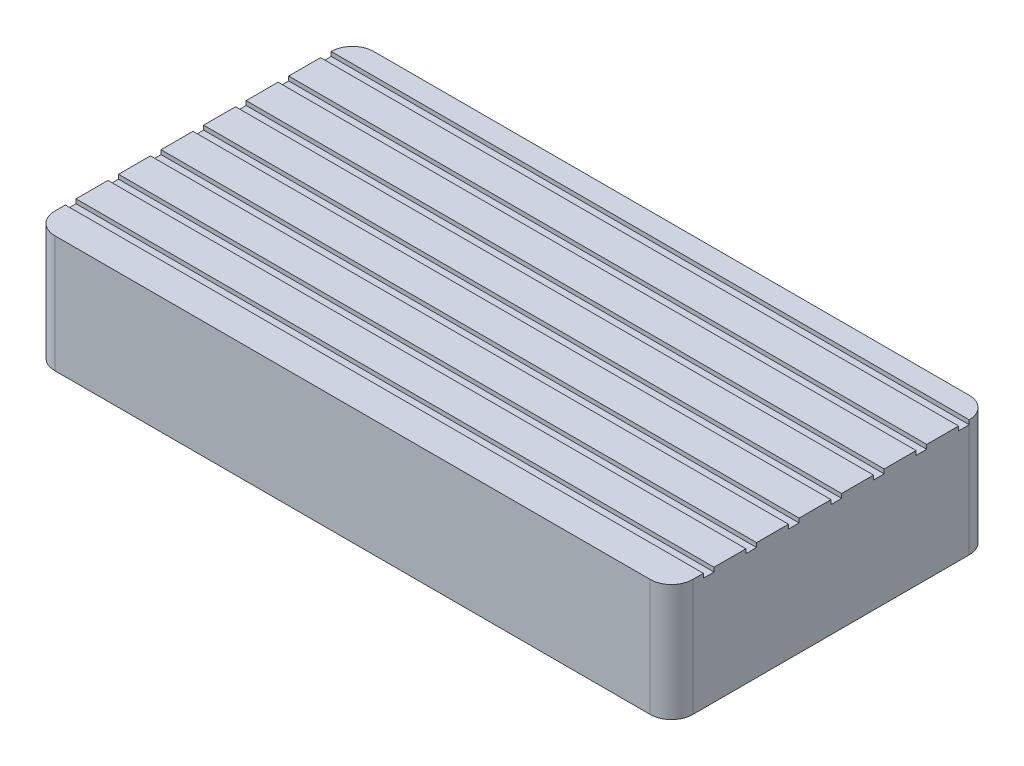
ISO-10303-21;
HEADER;
FILE_DESCRIPTION(('STEP AP214'),'2;1');
FILE_NAME('part.step','',(''),(''),'','','');
FILE_SCHEMA(('AUTOMOTIVE_DESIGN { 1 0 10303 214 1 1 1 1 }'));
ENDSEC;
DATA;
#1=APPLICATION_CONTEXT('core data for automotive mechanical design processes');
#2=APPLICATION_PROTOCOL_DEFINITION('international standard','automotive_design',2000,#1);
#3=PRODUCT_CONTEXT('',#1,'mechanical');
#4=PRODUCT('Part','Part','',(#3));
#5=PRODUCT_RELATED_PRODUCT_CATEGORY('part','',(#4));
#6=PRODUCT_DEFINITION_FORMATION('','',#4);
#7=PRODUCT_DEFINITION_CONTEXT('part definition',#1,'design');
#8=PRODUCT_DEFINITION('design','',#6,#7);
#9=PRODUCT_DEFINITION_SHAPE('','',#8);
#10=(LENGTH_UNIT() NAMED_UNIT(*) SI_UNIT(.MILLI.,.METRE.));
#11=(NAMED_UNIT(*) PLANE_ANGLE_UNIT() SI_UNIT($,.RADIAN.));
#12=(NAMED_UNIT(*) SI_UNIT($,.STERADIAN.) SOLID_ANGLE_UNIT());
#13=UNCERTAINTY_MEASURE_WITH_UNIT(LENGTH_MEASURE(1.E-05),#10,'distance_accuracy_value','');
#14=(GEOMETRIC_REPRESENTATION_CONTEXT(3) GLOBAL_UNCERTAINTY_ASSIGNED_CONTEXT((#13)) GLOBAL_UNIT_ASSIGNED_CONTEXT((#10,
#11,#12)) REPRESENTATION_CONTEXT('',''));
#15=CARTESIAN_POINT('',(0.,0.,0.));
#16=DIRECTION('',(0.,0.,1.));
#17=DIRECTION('',(1.,0.,0.));
#18=AXIS2_PLACEMENT_3D('',#15,#16,#17);
#19=CARTESIAN_POINT('',(0.,5.5,0.));
#20=DIRECTION('',(0.,-1.,0.));
#21=DIRECTION('',(0.,0.,-1.));
#22=AXIS2_PLACEMENT_3D('',#19,#20,#21);
#23=PLANE('',#22);
#24=DIRECTION('',(0.,0.,1.));
#25=VECTOR('',#24,1.);
#26=CARTESIAN_POINT('',(-15.,5.5,7.5));
#27=LINE('',#26,#25);
#28=CARTESIAN_POINT('',(-15.,5.5,6.));
#29=VERTEX_POINT('',#28);
#30=CARTESIAN_POINT('',(-15.,5.5,6.5));
#31=VERTEX_POINT('',#30);
#32=EDGE_CURVE('E457',#29,#31,#27,.T.);
#33=ORIENTED_EDGE('',*,*,#32,.T.);
#34=CARTESIAN_POINT('',(-14.,5.5,6.5));
#35=DIRECTION('',(0.,-1.,0.));
#36=DIRECTION('',(0.,0.,-1.));
#37=AXIS2_PLACEMENT_3D('',#34,#35,#36);
#38=CIRCLE('',#37,1.);
#39=CARTESIAN_POINT('',(-14.,5.5,7.5));
#40=VERTEX_POINT('',#39);
#41=EDGE_CURVE('E499',#31,#40,#38,.F.);
#42=ORIENTED_EDGE('',*,*,#41,.T.);
#43=DIRECTION('',(1.,0.,0.));
#44=VECTOR('',#43,1.);
#45=CARTESIAN_POINT('',(-15.,5.5,7.5));
#46=LINE('',#45,#44);
#47=CARTESIAN_POINT('',(14.,5.5,7.5));
#48=VERTEX_POINT('',#47);
#49=EDGE_CURVE('E463',#40,#48,#46,.T.);
#50=ORIENTED_EDGE('',*,*,#49,.T.);
#51=CARTESIAN_POINT('',(14.,5.5,6.5));
#52=DIRECTION('',(0.,-1.,0.));
#53=DIRECTION('',(0.,0.,-1.));
#54=AXIS2_PLACEMENT_3D('',#51,#52,#53);
#55=CIRCLE('',#54,1.);
#56=CARTESIAN_POINT('',(15.,5.5,6.5));
#57=VERTEX_POINT('',#56);
#58=EDGE_CURVE('E497',#48,#57,#55,.F.);
#59=ORIENTED_EDGE('',*,*,#58,.T.);
#60=DIRECTION('',(0.,0.,-1.));
#61=VECTOR('',#60,1.);
#62=CARTESIAN_POINT('',(15.,5.5,7.5));
#63=LINE('',#62,#61);
#64=CARTESIAN_POINT('',(15.,5.5,6.));
#65=VERTEX_POINT('',#64);
#66=EDGE_CURVE('E467',#57,#65,#63,.T.);
#67=ORIENTED_EDGE('',*,*,#66,.T.);
#68=DIRECTION('',(1.,0.,0.));
#69=VECTOR('',#68,1.);
#70=CARTESIAN_POINT('',(-15.,5.5,6.));
#71=LINE('',#70,#69);
#72=EDGE_CURVE('E279',#29,#65,#71,.T.);
#73=ORIENTED_EDGE('',*,*,#72,.F.);
#74=EDGE_LOOP('',(#33,#42,#50,#59,#67,#73));
#75=FACE_BOUND('',#74,.T.);
#76=ADVANCED_FACE('F33',(#75),#23,.F.);
#77=CARTESIAN_POINT('',(-15.,5.5,4.));
#78=VERTEX_POINT('',#77);
#79=CARTESIAN_POINT('',(-15.,5.5,5.5));
#80=VERTEX_POINT('',#79);
#81=EDGE_CURVE('E460',#78,#80,#27,.T.);
#82=ORIENTED_EDGE('',*,*,#81,.T.);
#83=DIRECTION('',(1.,0.,0.));
#84=VECTOR('',#83,1.);
#85=CARTESIAN_POINT('',(-15.,5.5,5.5));
#86=LINE('',#85,#84);
#87=CARTESIAN_POINT('',(15.,5.5,5.5));
#88=VERTEX_POINT('',#87);
#89=EDGE_CURVE('E298',#80,#88,#86,.T.);
#90=ORIENTED_EDGE('',*,*,#89,.T.);
#91=CARTESIAN_POINT('',(15.,5.5,4.));
#92=VERTEX_POINT('',#91);
#93=EDGE_CURVE('E470',#88,#92,#63,.T.);
#94=ORIENTED_EDGE('',*,*,#93,.T.);
#95=DIRECTION('',(1.,0.,0.));
#96=VECTOR('',#95,1.);
#97=CARTESIAN_POINT('',(-15.,5.5,4.));
#98=LINE('',#97,#96);
#99=EDGE_CURVE('E282',#78,#92,#98,.T.);
#100=ORIENTED_EDGE('',*,*,#99,.F.);
#101=EDGE_LOOP('',(#82,#90,#94,#100));
#102=FACE_BOUND('',#101,.T.);
#103=ADVANCED_FACE('F573',(#102),#23,.F.);
#104=CARTESIAN_POINT('',(-15.,5.5,2.));
#105=VERTEX_POINT('',#104);
#106=CARTESIAN_POINT('',(-15.,5.5,3.5));
#107=VERTEX_POINT('',#106);
#108=EDGE_CURVE('E582',#105,#107,#27,.T.);
#109=ORIENTED_EDGE('',*,*,#108,.T.);
#110=DIRECTION('',(1.,0.,0.));
#111=VECTOR('',#110,1.);
#112=CARTESIAN_POINT('',(-15.,5.5,3.5));
#113=LINE('',#112,#111);
#114=CARTESIAN_POINT('',(15.,5.5,3.5));
#115=VERTEX_POINT('',#114);
#116=EDGE_CURVE('E322',#107,#115,#113,.T.);
#117=ORIENTED_EDGE('',*,*,#116,.T.);
#118=CARTESIAN_POINT('',(15.,5.5,2.));
#119=VERTEX_POINT('',#118);
#120=EDGE_CURVE('E561',#115,#119,#63,.T.);
#121=ORIENTED_EDGE('',*,*,#120,.T.);
#122=DIRECTION('',(1.,0.,0.));
#123=VECTOR('',#122,1.);
#124=CARTESIAN_POINT('',(-15.,5.5,2.));
#125=LINE('',#124,#123);
#126=EDGE_CURVE('E306',#105,#119,#125,.T.);
#127=ORIENTED_EDGE('',*,*,#126,.F.);
#128=EDGE_LOOP('',(#109,#117,#121,#127));
#129=FACE_BOUND('',#128,.T.);
#130=ADVANCED_FACE('F640',(#129),#23,.F.);
#131=CARTESIAN_POINT('',(-15.,5.5,0.));
#132=VERTEX_POINT('',#131);
#133=CARTESIAN_POINT('',(-15.,5.5,1.5));
#134=VERTEX_POINT('',#133);
#135=EDGE_CURVE('E584',#132,#134,#27,.T.);
#136=ORIENTED_EDGE('',*,*,#135,.T.);
#137=DIRECTION('',(1.,0.,0.));
#138=VECTOR('',#137,1.);
#139=CARTESIAN_POINT('',(-15.,5.5,1.5));
#140=LINE('',#139,#138);
#141=CARTESIAN_POINT('',(15.,5.5,1.5));
#142=VERTEX_POINT('',#141);
#143=EDGE_CURVE('E348',#134,#142,#140,.T.);
#144=ORIENTED_EDGE('',*,*,#143,.T.);
#145=CARTESIAN_POINT('',(15.,5.5,0.));
#146=VERTEX_POINT('',#145);
#147=EDGE_CURVE('E556',#142,#146,#63,.T.);
#148=ORIENTED_EDGE('',*,*,#147,.T.);
#149=DIRECTION('',(1.,0.,0.));
#150=VECTOR('',#149,1.);
#151=CARTESIAN_POINT('',(-15.,5.5,0.));
#152=LINE('',#151,#150);
#153=EDGE_CURVE('E332',#132,#146,#152,.T.);
#154=ORIENTED_EDGE('',*,*,#153,.F.);
#155=EDGE_LOOP('',(#136,#144,#148,#154));
#156=FACE_BOUND('',#155,.T.);
#157=ADVANCED_FACE('F628',(#156),#23,.F.);
#158=CARTESIAN_POINT('',(-15.,5.5,-2.));
#159=VERTEX_POINT('',#158);
#160=CARTESIAN_POINT('',(-15.,5.5,-0.500000000000002));
#161=VERTEX_POINT('',#160);
#162=EDGE_CURVE('E587',#159,#161,#27,.T.);
#163=ORIENTED_EDGE('',*,*,#162,.T.);
#164=DIRECTION('',(1.,0.,0.));
#165=VECTOR('',#164,1.);
#166=CARTESIAN_POINT('',(-15.,5.5,-0.500000000000002));
#167=LINE('',#166,#165);
#168=CARTESIAN_POINT('',(15.,5.5,-0.500000000000002));
#169=VERTEX_POINT('',#168);
#170=EDGE_CURVE('E374',#161,#169,#167,.T.);
#171=ORIENTED_EDGE('',*,*,#170,.T.);
#172=CARTESIAN_POINT('',(15.,5.5,-2.));
#173=VERTEX_POINT('',#172);
#174=EDGE_CURVE('E551',#169,#173,#63,.T.);
#175=ORIENTED_EDGE('',*,*,#174,.T.);
#176=DIRECTION('',(1.,0.,0.));
#177=VECTOR('',#176,1.);
#178=CARTESIAN_POINT('',(-15.,5.5,-2.));
#179=LINE('',#178,#177);
#180=EDGE_CURVE('E358',#159,#173,#179,.T.);
#181=ORIENTED_EDGE('',*,*,#180,.F.);
#182=EDGE_LOOP('',(#163,#171,#175,#181));
#183=FACE_BOUND('',#182,.T.);
#184=ADVANCED_FACE('F616',(#183),#23,.F.);
#185=CARTESIAN_POINT('',(-15.,5.5,-4.));
#186=VERTEX_POINT('',#185);
#187=CARTESIAN_POINT('',(-15.,5.5,-2.5));
#188=VERTEX_POINT('',#187);
#189=EDGE_CURVE('E590',#186,#188,#27,.T.);
#190=ORIENTED_EDGE('',*,*,#189,.T.);
#191=DIRECTION('',(1.,0.,0.));
#192=VECTOR('',#191,1.);
#193=CARTESIAN_POINT('',(-15.,5.5,-2.5));
#194=LINE('',#193,#192);
#195=CARTESIAN_POINT('',(15.,5.5,-2.5));
#196=VERTEX_POINT('',#195);
#197=EDGE_CURVE('E400',#188,#196,#194,.T.);
#198=ORIENTED_EDGE('',*,*,#197,.T.);
#199=CARTESIAN_POINT('',(15.,5.5,-4.));
#200=VERTEX_POINT('',#199);
#201=EDGE_CURVE('E549',#196,#200,#63,.T.);
#202=ORIENTED_EDGE('',*,*,#201,.T.);
#203=DIRECTION('',(1.,0.,0.));
#204=VECTOR('',#203,1.);
#205=CARTESIAN_POINT('',(-15.,5.5,-4.));
#206=LINE('',#205,#204);
#207=EDGE_CURVE('E384',#186,#200,#206,.T.);
#208=ORIENTED_EDGE('',*,*,#207,.F.);
#209=EDGE_LOOP('',(#190,#198,#202,#208));
#210=FACE_BOUND('',#209,.T.);
#211=ADVANCED_FACE('F604',(#210),#23,.F.);
#212=CARTESIAN_POINT('',(-15.,5.5,-6.));
#213=VERTEX_POINT('',#212);
#214=CARTESIAN_POINT('',(-15.,5.5,-4.5));
#215=VERTEX_POINT('',#214);
#216=EDGE_CURVE('E462',#213,#215,#27,.T.);
#217=ORIENTED_EDGE('',*,*,#216,.T.);
#218=DIRECTION('',(1.,0.,0.));
#219=VECTOR('',#218,1.);
#220=CARTESIAN_POINT('',(-15.,5.5,-4.5));
#221=LINE('',#220,#219);
#222=CARTESIAN_POINT('',(15.,5.5,-4.5));
#223=VERTEX_POINT('',#222);
#224=EDGE_CURVE('E426',#215,#223,#221,.T.);
#225=ORIENTED_EDGE('',*,*,#224,.T.);
#226=CARTESIAN_POINT('',(15.,5.5,-6.));
#227=VERTEX_POINT('',#226);
#228=EDGE_CURVE('E466',#223,#227,#63,.T.);
#229=ORIENTED_EDGE('',*,*,#228,.T.);
#230=DIRECTION('',(1.,0.,0.));
#231=VECTOR('',#230,1.);
#232=CARTESIAN_POINT('',(-15.,5.5,-6.));
#233=LINE('',#232,#231);
#234=EDGE_CURVE('E410',#213,#227,#233,.T.);
#235=ORIENTED_EDGE('',*,*,#234,.F.);
#236=EDGE_LOOP('',(#217,#225,#229,#235));
#237=FACE_BOUND('',#236,.T.);
#238=ADVANCED_FACE('F548',(#237),#23,.F.);
#239=CARTESIAN_POINT('',(-15.,5.5,7.5));
#240=DIRECTION('',(1.,0.,0.));
#241=DIRECTION('',(0.,0.,-1.));
#242=AXIS2_PLACEMENT_3D('',#239,#240,#241);
#243=PLANE('',#242);
#244=DIRECTION('',(0.,0.,1.));
#245=VECTOR('',#244,1.);
#246=CARTESIAN_POINT('',(-15.,0.,7.5));
#247=LINE('',#246,#245);
#248=CARTESIAN_POINT('',(-15.,0.,-6.5));
#249=VERTEX_POINT('',#248);
#250=CARTESIAN_POINT('',(-15.,0.,6.5));
#251=VERTEX_POINT('',#250);
#252=EDGE_CURVE('E297',#249,#251,#247,.T.);
#253=ORIENTED_EDGE('',*,*,#252,.T.);
#254=DIRECTION('',(0.,-1.,0.));
#255=VECTOR('',#254,1.);
#256=CARTESIAN_POINT('',(-15.,5.5,6.5));
#257=LINE('',#256,#255);
#258=EDGE_CURVE('E495',#251,#31,#257,.F.);
#259=ORIENTED_EDGE('',*,*,#258,.T.);
#260=ORIENTED_EDGE('',*,*,#32,.F.);
#261=DIRECTION('',(0.,-1.,0.));
#262=VECTOR('',#261,1.);
#263=CARTESIAN_POINT('',(-15.,5.5,6.));
#264=LINE('',#263,#262);
#265=CARTESIAN_POINT('',(-15.,5.3,6.));
#266=VERTEX_POINT('',#265);
#267=EDGE_CURVE('E289',#29,#266,#264,.T.);
#268=ORIENTED_EDGE('',*,*,#267,.T.);
#269=DIRECTION('',(0.,0.,-1.));
#270=VECTOR('',#269,1.);
#271=CARTESIAN_POINT('',(-15.,5.3,6.));
#272=LINE('',#271,#270);
#273=CARTESIAN_POINT('',(-15.,5.3,5.5));
#274=VERTEX_POINT('',#273);
#275=EDGE_CURVE('E268',#266,#274,#272,.T.);
#276=ORIENTED_EDGE('',*,*,#275,.T.);
#277=DIRECTION('',(0.,1.,0.));
#278=VECTOR('',#277,1.);
#279=CARTESIAN_POINT('',(-15.,5.5,5.5));
#280=LINE('',#279,#278);
#281=EDGE_CURVE('E272',#274,#80,#280,.T.);
#282=ORIENTED_EDGE('',*,*,#281,.T.);
#283=ORIENTED_EDGE('',*,*,#81,.F.);
#284=DIRECTION('',(0.,-1.,0.));
#285=VECTOR('',#284,1.);
#286=CARTESIAN_POINT('',(-15.,5.5,4.));
#287=LINE('',#286,#285);
#288=CARTESIAN_POINT('',(-15.,5.3,4.));
#289=VERTEX_POINT('',#288);
#290=EDGE_CURVE('E311',#78,#289,#287,.T.);
#291=ORIENTED_EDGE('',*,*,#290,.T.);
#292=DIRECTION('',(0.,0.,-1.));
#293=VECTOR('',#292,1.);
#294=CARTESIAN_POINT('',(-15.,5.3,4.));
#295=LINE('',#294,#293);
#296=CARTESIAN_POINT('',(-15.,5.3,3.5));
#297=VERTEX_POINT('',#296);
#298=EDGE_CURVE('E314',#289,#297,#295,.T.);
#299=ORIENTED_EDGE('',*,*,#298,.T.);
#300=DIRECTION('',(0.,1.,0.));
#301=VECTOR('',#300,1.);
#302=CARTESIAN_POINT('',(-15.,5.5,3.5));
#303=LINE('',#302,#301);
#304=EDGE_CURVE('E317',#297,#107,#303,.T.);
#305=ORIENTED_EDGE('',*,*,#304,.T.);
#306=ORIENTED_EDGE('',*,*,#108,.F.);
#307=DIRECTION('',(0.,-1.,0.));
#308=VECTOR('',#307,1.);
#309=CARTESIAN_POINT('',(-15.,5.5,2.));
#310=LINE('',#309,#308);
#311=CARTESIAN_POINT('',(-15.,5.3,2.));
#312=VERTEX_POINT('',#311);
#313=EDGE_CURVE('E337',#105,#312,#310,.T.);
#314=ORIENTED_EDGE('',*,*,#313,.T.);
#315=DIRECTION('',(0.,0.,-1.));
#316=VECTOR('',#315,1.);
#317=CARTESIAN_POINT('',(-15.,5.3,2.));
#318=LINE('',#317,#316);
#319=CARTESIAN_POINT('',(-15.,5.3,1.5));
#320=VERTEX_POINT('',#319);
#321=EDGE_CURVE('E340',#312,#320,#318,.T.);
#322=ORIENTED_EDGE('',*,*,#321,.T.);
#323=DIRECTION('',(0.,1.,0.));
#324=VECTOR('',#323,1.);
#325=CARTESIAN_POINT('',(-15.,5.5,1.5));
#326=LINE('',#325,#324);
#327=EDGE_CURVE('E343',#320,#134,#326,.T.);
#328=ORIENTED_EDGE('',*,*,#327,.T.);
#329=ORIENTED_EDGE('',*,*,#135,.F.);
#330=DIRECTION('',(0.,-1.,0.));
#331=VECTOR('',#330,1.);
#332=CARTESIAN_POINT('',(-15.,5.5,0.));
#333=LINE('',#332,#331);
#334=CARTESIAN_POINT('',(-15.,5.3,0.));
#335=VERTEX_POINT('',#334);
#336=EDGE_CURVE('E363',#132,#335,#333,.T.);
#337=ORIENTED_EDGE('',*,*,#336,.T.);
#338=DIRECTION('',(0.,0.,-1.));
#339=VECTOR('',#338,1.);
#340=CARTESIAN_POINT('',(-15.,5.3,0.));
#341=LINE('',#340,#339);
#342=CARTESIAN_POINT('',(-15.,5.3,-0.500000000000002));
#343=VERTEX_POINT('',#342);
#344=EDGE_CURVE('E366',#335,#343,#341,.T.);
#345=ORIENTED_EDGE('',*,*,#344,.T.);
#346=DIRECTION('',(0.,1.,0.));
#347=VECTOR('',#346,1.);
#348=CARTESIAN_POINT('',(-15.,5.5,-0.500000000000002));
#349=LINE('',#348,#347);
#350=EDGE_CURVE('E369',#343,#161,#349,.T.);
#351=ORIENTED_EDGE('',*,*,#350,.T.);
#352=ORIENTED_EDGE('',*,*,#162,.F.);
#353=DIRECTION('',(0.,-1.,0.));
#354=VECTOR('',#353,1.);
#355=CARTESIAN_POINT('',(-15.,5.5,-2.));
#356=LINE('',#355,#354);
#357=CARTESIAN_POINT('',(-15.,5.3,-2.));
#358=VERTEX_POINT('',#357);
#359=EDGE_CURVE('E389',#159,#358,#356,.T.);
#360=ORIENTED_EDGE('',*,*,#359,.T.);
#361=DIRECTION('',(0.,0.,-1.));
#362=VECTOR('',#361,1.);
#363=CARTESIAN_POINT('',(-15.,5.3,-2.));
#364=LINE('',#363,#362);
#365=CARTESIAN_POINT('',(-15.,5.3,-2.5));
#366=VERTEX_POINT('',#365);
#367=EDGE_CURVE('E392',#358,#366,#364,.T.);
#368=ORIENTED_EDGE('',*,*,#367,.T.);
#369=DIRECTION('',(0.,1.,0.));
#370=VECTOR('',#369,1.);
#371=CARTESIAN_POINT('',(-15.,5.5,-2.5));
#372=LINE('',#371,#370);
#373=EDGE_CURVE('E395',#366,#188,#372,.T.);
#374=ORIENTED_EDGE('',*,*,#373,.T.);
#375=ORIENTED_EDGE('',*,*,#189,.F.);
#376=DIRECTION('',(0.,-1.,0.));
#377=VECTOR('',#376,1.);
#378=CARTESIAN_POINT('',(-15.,5.5,-4.));
#379=LINE('',#378,#377);
#380=CARTESIAN_POINT('',(-15.,5.3,-4.));
#381=VERTEX_POINT('',#380);
#382=EDGE_CURVE('E415',#186,#381,#379,.T.);
#383=ORIENTED_EDGE('',*,*,#382,.T.);
#384=DIRECTION('',(0.,0.,-1.));
#385=VECTOR('',#384,1.);
#386=CARTESIAN_POINT('',(-15.,5.3,-4.));
#387=LINE('',#386,#385);
#388=CARTESIAN_POINT('',(-15.,5.3,-4.5));
#389=VERTEX_POINT('',#388);
#390=EDGE_CURVE('E418',#381,#389,#387,.T.);
#391=ORIENTED_EDGE('',*,*,#390,.T.);
#392=DIRECTION('',(0.,1.,0.));
#393=VECTOR('',#392,1.);
#394=CARTESIAN_POINT('',(-15.,5.5,-4.5));
#395=LINE('',#394,#393);
#396=EDGE_CURVE('E421',#389,#215,#395,.T.);
#397=ORIENTED_EDGE('',*,*,#396,.T.);
#398=ORIENTED_EDGE('',*,*,#216,.F.);
#399=DIRECTION('',(0.,-1.,0.));
#400=VECTOR('',#399,1.);
#401=CARTESIAN_POINT('',(-15.,5.5,-6.));
#402=LINE('',#401,#400);
#403=CARTESIAN_POINT('',(-15.,5.3,-6.));
#404=VERTEX_POINT('',#403);
#405=EDGE_CURVE('E440',#213,#404,#402,.T.);
#406=ORIENTED_EDGE('',*,*,#405,.T.);
#407=DIRECTION('',(0.,0.,-1.));
#408=VECTOR('',#407,1.);
#409=CARTESIAN_POINT('',(-15.,5.3,-6.));
#410=LINE('',#409,#408);
#411=CARTESIAN_POINT('',(-15.,5.3,-6.5));
#412=VERTEX_POINT('',#411);
#413=EDGE_CURVE('E443',#404,#412,#410,.T.);
#414=ORIENTED_EDGE('',*,*,#413,.T.);
#415=DIRECTION('',(0.,-1.,0.));
#416=VECTOR('',#415,1.);
#417=CARTESIAN_POINT('',(-15.,5.5,-6.5));
#418=LINE('',#417,#416);
#419=EDGE_CURVE('E493',#412,#249,#418,.T.);
#420=ORIENTED_EDGE('',*,*,#419,.T.);
#421=EDGE_LOOP('',(#253,#259,#260,#268,#276,#282,#283,#291,#299,#305,#306,#314,#322,#328,#329,
#337,#345,#351,#352,#360,#368,#374,#375,#383,#391,#397,#398,#406,#414,#420));
#422=FACE_BOUND('',#421,.T.);
#423=ADVANCED_FACE('F534',(#422),#243,.F.);
#424=CARTESIAN_POINT('',(-15.,5.5,7.5));
#425=DIRECTION('',(0.,0.,-1.));
#426=DIRECTION('',(-1.,0.,0.));
#427=AXIS2_PLACEMENT_3D('',#424,#425,#426);
#428=PLANE('',#427);
#429=ORIENTED_EDGE('',*,*,#49,.F.);
#430=DIRECTION('',(0.,-1.,0.));
#431=VECTOR('',#430,1.);
#432=CARTESIAN_POINT('',(-14.,5.5,7.5));
#433=LINE('',#432,#431);
#434=CARTESIAN_POINT('',(-14.,0.,7.5));
#435=VERTEX_POINT('',#434);
#436=EDGE_CURVE('E482',#40,#435,#433,.T.);
#437=ORIENTED_EDGE('',*,*,#436,.T.);
#438=DIRECTION('',(1.,0.,0.));
#439=VECTOR('',#438,1.);
#440=CARTESIAN_POINT('',(-15.,0.,7.5));
#441=LINE('',#440,#439);
#442=CARTESIAN_POINT('',(14.,0.,7.5));
#443=VERTEX_POINT('',#442);
#444=EDGE_CURVE('E475',#435,#443,#441,.T.);
#445=ORIENTED_EDGE('',*,*,#444,.T.);
#446=DIRECTION('',(0.,-1.,0.));
#447=VECTOR('',#446,1.);
#448=CARTESIAN_POINT('',(14.,5.5,7.5));
#449=LINE('',#448,#447);
#450=EDGE_CURVE('E472',#443,#48,#449,.F.);
#451=ORIENTED_EDGE('',*,*,#450,.T.);
#452=EDGE_LOOP('',(#429,#437,#445,#451));
#453=FACE_BOUND('',#452,.T.);
#454=ADVANCED_FACE('F676',(#453),#428,.F.);
#455=CARTESIAN_POINT('',(15.,5.5,7.5));
#456=DIRECTION('',(-1.,0.,0.));
#457=DIRECTION('',(0.,0.,1.));
#458=AXIS2_PLACEMENT_3D('',#455,#456,#457);
#459=PLANE('',#458);
#460=DIRECTION('',(0.,0.,-1.));
#461=VECTOR('',#460,1.);
#462=CARTESIAN_POINT('',(15.,0.,7.5));
#463=LINE('',#462,#461);
#464=CARTESIAN_POINT('',(15.,0.,6.5));
#465=VERTEX_POINT('',#464);
#466=CARTESIAN_POINT('',(15.,0.,-6.5));
#467=VERTEX_POINT('',#466);
#468=EDGE_CURVE('E478',#465,#467,#463,.T.);
#469=ORIENTED_EDGE('',*,*,#468,.T.);
#470=DIRECTION('',(0.,-1.,0.));
#471=VECTOR('',#470,1.);
#472=CARTESIAN_POINT('',(15.,5.5,-6.5));
#473=LINE('',#472,#471);
#474=CARTESIAN_POINT('',(15.,5.3,-6.5));
#475=VERTEX_POINT('',#474);
#476=EDGE_CURVE('E11',#467,#475,#473,.F.);
#477=ORIENTED_EDGE('',*,*,#476,.T.);
#478=DIRECTION('',(0.,0.,-1.));
#479=VECTOR('',#478,1.);
#480=CARTESIAN_POINT('',(15.,5.3,-6.));
#481=LINE('',#480,#479);
#482=CARTESIAN_POINT('',(15.,5.3,-6.));
#483=VERTEX_POINT('',#482);
#484=EDGE_CURVE('E435',#483,#475,#481,.T.);
#485=ORIENTED_EDGE('',*,*,#484,.F.);
#486=DIRECTION('',(0.,-1.,0.));
#487=VECTOR('',#486,1.);
#488=CARTESIAN_POINT('',(15.,5.5,-6.));
#489=LINE('',#488,#487);
#490=EDGE_CURVE('E432',#227,#483,#489,.T.);
#491=ORIENTED_EDGE('',*,*,#490,.F.);
#492=ORIENTED_EDGE('',*,*,#228,.F.);
#493=DIRECTION('',(0.,1.,0.));
#494=VECTOR('',#493,1.);
#495=CARTESIAN_POINT('',(15.,5.5,-4.5));
#496=LINE('',#495,#494);
#497=CARTESIAN_POINT('',(15.,5.3,-4.5));
#498=VERTEX_POINT('',#497);
#499=EDGE_CURVE('E413',#498,#223,#496,.T.);
#500=ORIENTED_EDGE('',*,*,#499,.F.);
#501=DIRECTION('',(0.,0.,-1.));
#502=VECTOR('',#501,1.);
#503=CARTESIAN_POINT('',(15.,5.3,-4.));
#504=LINE('',#503,#502);
#505=CARTESIAN_POINT('',(15.,5.3,-4.));
#506=VERTEX_POINT('',#505);
#507=EDGE_CURVE('E409',#506,#498,#504,.T.);
#508=ORIENTED_EDGE('',*,*,#507,.F.);
#509=DIRECTION('',(0.,-1.,0.));
#510=VECTOR('',#509,1.);
#511=CARTESIAN_POINT('',(15.,5.5,-4.));
#512=LINE('',#511,#510);
#513=EDGE_CURVE('E406',#200,#506,#512,.T.);
#514=ORIENTED_EDGE('',*,*,#513,.F.);
#515=ORIENTED_EDGE('',*,*,#201,.F.);
#516=DIRECTION('',(0.,1.,0.));
#517=VECTOR('',#516,1.);
#518=CARTESIAN_POINT('',(15.,5.5,-2.5));
#519=LINE('',#518,#517);
#520=CARTESIAN_POINT('',(15.,5.3,-2.5));
#521=VERTEX_POINT('',#520);
#522=EDGE_CURVE('E387',#521,#196,#519,.T.);
#523=ORIENTED_EDGE('',*,*,#522,.F.);
#524=DIRECTION('',(0.,0.,-1.));
#525=VECTOR('',#524,1.);
#526=CARTESIAN_POINT('',(15.,5.3,-2.));
#527=LINE('',#526,#525);
#528=CARTESIAN_POINT('',(15.,5.3,-2.));
#529=VERTEX_POINT('',#528);
#530=EDGE_CURVE('E383',#529,#521,#527,.T.);
#531=ORIENTED_EDGE('',*,*,#530,.F.);
#532=DIRECTION('',(0.,-1.,0.));
#533=VECTOR('',#532,1.);
#534=CARTESIAN_POINT('',(15.,5.5,-2.));
#535=LINE('',#534,#533);
#536=EDGE_CURVE('E380',#173,#529,#535,.T.);
#537=ORIENTED_EDGE('',*,*,#536,.F.);
#538=ORIENTED_EDGE('',*,*,#174,.F.);
#539=DIRECTION('',(0.,1.,0.));
#540=VECTOR('',#539,1.);
#541=CARTESIAN_POINT('',(15.,5.5,-0.500000000000002));
#542=LINE('',#541,#540);
#543=CARTESIAN_POINT('',(15.,5.3,-0.500000000000002));
#544=VERTEX_POINT('',#543);
#545=EDGE_CURVE('E361',#544,#169,#542,.T.);
#546=ORIENTED_EDGE('',*,*,#545,.F.);
#547=DIRECTION('',(0.,0.,-1.));
#548=VECTOR('',#547,1.);
#549=CARTESIAN_POINT('',(15.,5.3,0.));
#550=LINE('',#549,#548);
#551=CARTESIAN_POINT('',(15.,5.3,0.));
#552=VERTEX_POINT('',#551);
#553=EDGE_CURVE('E357',#552,#544,#550,.T.);
#554=ORIENTED_EDGE('',*,*,#553,.F.);
#555=DIRECTION('',(0.,-1.,0.));
#556=VECTOR('',#555,1.);
#557=CARTESIAN_POINT('',(15.,5.5,0.));
#558=LINE('',#557,#556);
#559=EDGE_CURVE('E354',#146,#552,#558,.T.);
#560=ORIENTED_EDGE('',*,*,#559,.F.);
#561=ORIENTED_EDGE('',*,*,#147,.F.);
#562=DIRECTION('',(0.,1.,0.));
#563=VECTOR('',#562,1.);
#564=CARTESIAN_POINT('',(15.,5.5,1.5));
#565=LINE('',#564,#563);
#566=CARTESIAN_POINT('',(15.,5.3,1.5));
#567=VERTEX_POINT('',#566);
#568=EDGE_CURVE('E335',#567,#142,#565,.T.);
#569=ORIENTED_EDGE('',*,*,#568,.F.);
#570=DIRECTION('',(0.,0.,-1.));
#571=VECTOR('',#570,1.);
#572=CARTESIAN_POINT('',(15.,5.3,2.));
#573=LINE('',#572,#571);
#574=CARTESIAN_POINT('',(15.,5.3,2.));
#575=VERTEX_POINT('',#574);
#576=EDGE_CURVE('E331',#575,#567,#573,.T.);
#577=ORIENTED_EDGE('',*,*,#576,.F.);
#578=DIRECTION('',(0.,-1.,0.));
#579=VECTOR('',#578,1.);
#580=CARTESIAN_POINT('',(15.,5.5,2.));
#581=LINE('',#580,#579);
#582=EDGE_CURVE('E328',#119,#575,#581,.T.);
#583=ORIENTED_EDGE('',*,*,#582,.F.);
#584=ORIENTED_EDGE('',*,*,#120,.F.);
#585=DIRECTION('',(0.,1.,0.));
#586=VECTOR('',#585,1.);
#587=CARTESIAN_POINT('',(15.,5.5,3.5));
#588=LINE('',#587,#586);
#589=CARTESIAN_POINT('',(15.,5.3,3.5));
#590=VERTEX_POINT('',#589);
#591=EDGE_CURVE('E309',#590,#115,#588,.T.);
#592=ORIENTED_EDGE('',*,*,#591,.F.);
#593=DIRECTION('',(0.,0.,-1.));
#594=VECTOR('',#593,1.);
#595=CARTESIAN_POINT('',(15.,5.3,4.));
#596=LINE('',#595,#594);
#597=CARTESIAN_POINT('',(15.,5.3,4.));
#598=VERTEX_POINT('',#597);
#599=EDGE_CURVE('E305',#598,#590,#596,.T.);
#600=ORIENTED_EDGE('',*,*,#599,.F.);
#601=DIRECTION('',(0.,-1.,0.));
#602=VECTOR('',#601,1.);
#603=CARTESIAN_POINT('',(15.,5.5,4.));
#604=LINE('',#603,#602);
#605=EDGE_CURVE('E302',#92,#598,#604,.T.);
#606=ORIENTED_EDGE('',*,*,#605,.F.);
#607=ORIENTED_EDGE('',*,*,#93,.F.);
#608=DIRECTION('',(0.,1.,0.));
#609=VECTOR('',#608,1.);
#610=CARTESIAN_POINT('',(15.,5.5,5.5));
#611=LINE('',#610,#609);
#612=CARTESIAN_POINT('',(15.,5.3,5.5));
#613=VERTEX_POINT('',#612);
#614=EDGE_CURVE('E287',#613,#88,#611,.T.);
#615=ORIENTED_EDGE('',*,*,#614,.F.);
#616=DIRECTION('',(0.,0.,-1.));
#617=VECTOR('',#616,1.);
#618=CARTESIAN_POINT('',(15.,5.3,6.));
#619=LINE('',#618,#617);
#620=CARTESIAN_POINT('',(15.,5.3,6.));
#621=VERTEX_POINT('',#620);
#622=EDGE_CURVE('E265',#621,#613,#619,.T.);
#623=ORIENTED_EDGE('',*,*,#622,.F.);
#624=DIRECTION('',(0.,-1.,0.));
#625=VECTOR('',#624,1.);
#626=CARTESIAN_POINT('',(15.,5.5,6.));
#627=LINE('',#626,#625);
#628=EDGE_CURVE('E276',#65,#621,#627,.T.);
#629=ORIENTED_EDGE('',*,*,#628,.F.);
#630=ORIENTED_EDGE('',*,*,#66,.F.);
#631=DIRECTION('',(0.,-1.,0.));
#632=VECTOR('',#631,1.);
#633=CARTESIAN_POINT('',(15.,5.5,6.5));
#634=LINE('',#633,#632);
#635=EDGE_CURVE('E41',#57,#465,#634,.T.);
#636=ORIENTED_EDGE('',*,*,#635,.T.);
#637=EDGE_LOOP('',(#469,#477,#485,#491,#492,#500,#508,#514,#515,#523,#531,#537,#538,#546,#554,
#560,#561,#569,#577,#583,#584,#592,#600,#606,#607,#615,#623,#629,#630,#636));
#638=FACE_BOUND('',#637,.T.);
#639=ADVANCED_FACE('F285',(#638),#459,.F.);
#640=CARTESIAN_POINT('',(-15.,5.5,-7.5));
#641=DIRECTION('',(0.,0.,1.));
#642=DIRECTION('',(1.,0.,0.));
#643=AXIS2_PLACEMENT_3D('',#640,#641,#642);
#644=PLANE('',#643);
#645=DIRECTION('',(-1.,0.,0.));
#646=VECTOR('',#645,1.);
#647=CARTESIAN_POINT('',(-15.,0.,-7.5));
#648=LINE('',#647,#646);
#649=CARTESIAN_POINT('',(14.,0.,-7.5));
#650=VERTEX_POINT('',#649);
#651=CARTESIAN_POINT('',(-14.,0.,-7.5));
#652=VERTEX_POINT('',#651);
#653=EDGE_CURVE('E461',#650,#652,#648,.T.);
#654=ORIENTED_EDGE('',*,*,#653,.T.);
#655=DIRECTION('',(0.,-1.,0.));
#656=VECTOR('',#655,1.);
#657=CARTESIAN_POINT('',(-14.,5.5,-7.5));
#658=LINE('',#657,#656);
#659=CARTESIAN_POINT('',(-14.,5.5,-7.5));
#660=VERTEX_POINT('',#659);
#661=EDGE_CURVE('E48',#652,#660,#658,.F.);
#662=ORIENTED_EDGE('',*,*,#661,.T.);
#663=DIRECTION('',(-1.,0.,0.));
#664=VECTOR('',#663,1.);
#665=CARTESIAN_POINT('',(-15.,5.5,-7.5));
#666=LINE('',#665,#664);
#667=CARTESIAN_POINT('',(14.,5.5,-7.5));
#668=VERTEX_POINT('',#667);
#669=EDGE_CURVE('E469',#668,#660,#666,.T.);
#670=ORIENTED_EDGE('',*,*,#669,.F.);
#671=DIRECTION('',(0.,-1.,0.));
#672=VECTOR('',#671,1.);
#673=CARTESIAN_POINT('',(14.,5.5,-7.5));
#674=LINE('',#673,#672);
#675=EDGE_CURVE('E501',#668,#650,#674,.T.);
#676=ORIENTED_EDGE('',*,*,#675,.T.);
#677=EDGE_LOOP('',(#654,#662,#670,#676));
#678=FACE_BOUND('',#677,.T.);
#679=ADVANCED_FACE('F521',(#678),#644,.F.);
#680=ORIENTED_EDGE('',*,*,#669,.T.);
#681=CARTESIAN_POINT('',(-14.,5.5,-6.5));
#682=DIRECTION('',(0.,-1.,0.));
#683=DIRECTION('',(0.,0.,-1.));
#684=AXIS2_PLACEMENT_3D('',#681,#682,#683);
#685=CIRCLE('',#684,1.);
#686=CARTESIAN_POINT('',(-15.,5.5,-6.5));
#687=VERTEX_POINT('',#686);
#688=EDGE_CURVE('E506',#660,#687,#685,.F.);
#689=ORIENTED_EDGE('',*,*,#688,.T.);
#690=DIRECTION('',(1.,0.,0.));
#691=VECTOR('',#690,1.);
#692=CARTESIAN_POINT('',(-15.,5.5,-6.5));
#693=LINE('',#692,#691);
#694=CARTESIAN_POINT('',(15.,5.5,-6.5));
#695=VERTEX_POINT('',#694);
#696=EDGE_CURVE('E451',#687,#695,#693,.T.);
#697=ORIENTED_EDGE('',*,*,#696,.T.);
#698=CARTESIAN_POINT('',(14.,5.5,-6.5));
#699=DIRECTION('',(0.,-1.,0.));
#700=DIRECTION('',(0.,0.,-1.));
#701=AXIS2_PLACEMENT_3D('',#698,#699,#700);
#702=CIRCLE('',#701,1.);
#703=EDGE_CURVE('E55',#695,#668,#702,.F.);
#704=ORIENTED_EDGE('',*,*,#703,.T.);
#705=EDGE_LOOP('',(#680,#689,#697,#704));
#706=FACE_BOUND('',#705,.T.);
#707=ADVANCED_FACE('F523',(#706),#23,.F.);
#708=CARTESIAN_POINT('',(0.,0.,0.));
#709=DIRECTION('',(0.,-1.,0.));
#710=DIRECTION('',(0.,0.,-1.));
#711=AXIS2_PLACEMENT_3D('',#708,#709,#710);
#712=PLANE('',#711);
#713=ORIENTED_EDGE('',*,*,#444,.F.);
#714=CARTESIAN_POINT('',(-14.,0.,6.5));
#715=DIRECTION('',(0.,-1.,0.));
#716=DIRECTION('',(0.,0.,-1.));
#717=AXIS2_PLACEMENT_3D('',#714,#715,#716);
#718=CIRCLE('',#717,1.);
#719=EDGE_CURVE('E491',#435,#251,#718,.T.);
#720=ORIENTED_EDGE('',*,*,#719,.T.);
#721=ORIENTED_EDGE('',*,*,#252,.F.);
#722=CARTESIAN_POINT('',(-14.,0.,-6.5));
#723=DIRECTION('',(0.,-1.,0.));
#724=DIRECTION('',(0.,0.,-1.));
#725=AXIS2_PLACEMENT_3D('',#722,#723,#724);
#726=CIRCLE('',#725,1.);
#727=EDGE_CURVE('E489',#249,#652,#726,.T.);
#728=ORIENTED_EDGE('',*,*,#727,.T.);
#729=ORIENTED_EDGE('',*,*,#653,.F.);
#730=CARTESIAN_POINT('',(14.,0.,-6.5));
#731=DIRECTION('',(0.,-1.,0.));
#732=DIRECTION('',(0.,0.,-1.));
#733=AXIS2_PLACEMENT_3D('',#730,#731,#732);
#734=CIRCLE('',#733,1.);
#735=EDGE_CURVE('E487',#650,#467,#734,.T.);
#736=ORIENTED_EDGE('',*,*,#735,.T.);
#737=ORIENTED_EDGE('',*,*,#468,.F.);
#738=CARTESIAN_POINT('',(14.,0.,6.5));
#739=DIRECTION('',(0.,-1.,0.));
#740=DIRECTION('',(0.,0.,-1.));
#741=AXIS2_PLACEMENT_3D('',#738,#739,#740);
#742=CIRCLE('',#741,1.);
#743=EDGE_CURVE('E485',#465,#443,#742,.T.);
#744=ORIENTED_EDGE('',*,*,#743,.T.);
#745=EDGE_LOOP('',(#713,#720,#721,#728,#729,#736,#737,#744));
#746=FACE_BOUND('',#745,.T.);
#747=ADVANCED_FACE('F515',(#746),#712,.T.);
#748=CARTESIAN_POINT('',(-15.,5.5,-6.));
#749=DIRECTION('',(0.,0.,1.));
#750=DIRECTION('',(1.,0.,0.));
#751=AXIS2_PLACEMENT_3D('',#748,#749,#750);
#752=PLANE('',#751);
#753=DIRECTION('',(1.,0.,0.));
#754=VECTOR('',#753,1.);
#755=CARTESIAN_POINT('',(-15.,5.3,-6.));
#756=LINE('',#755,#754);
#757=EDGE_CURVE('E449',#404,#483,#756,.T.);
#758=ORIENTED_EDGE('',*,*,#757,.F.);
#759=ORIENTED_EDGE('',*,*,#405,.F.);
#760=ORIENTED_EDGE('',*,*,#234,.T.);
#761=ORIENTED_EDGE('',*,*,#490,.T.);
#762=EDGE_LOOP('',(#758,#759,#760,#761));
#763=FACE_BOUND('',#762,.T.);
#764=ADVANCED_FACE('F669',(#763),#752,.F.);
#765=CARTESIAN_POINT('',(-15.,5.5,-6.5));
#766=DIRECTION('',(0.,0.,-1.));
#767=DIRECTION('',(-1.,0.,0.));
#768=AXIS2_PLACEMENT_3D('',#765,#766,#767);
#769=PLANE('',#768);
#770=ORIENTED_EDGE('',*,*,#696,.F.);
#771=DIRECTION('',(0.,1.,0.));
#772=VECTOR('',#771,1.);
#773=CARTESIAN_POINT('',(-15.,5.5,-6.5));
#774=LINE('',#773,#772);
#775=EDGE_CURVE('E446',#412,#687,#774,.T.);
#776=ORIENTED_EDGE('',*,*,#775,.F.);
#777=DIRECTION('',(1.,0.,0.));
#778=VECTOR('',#777,1.);
#779=CARTESIAN_POINT('',(-15.,5.3,-6.5));
#780=LINE('',#779,#778);
#781=EDGE_CURVE('E453',#412,#475,#780,.T.);
#782=ORIENTED_EDGE('',*,*,#781,.T.);
#783=DIRECTION('',(0.,1.,0.));
#784=VECTOR('',#783,1.);
#785=CARTESIAN_POINT('',(15.,5.5,-6.5));
#786=LINE('',#785,#784);
#787=EDGE_CURVE('E438',#475,#695,#786,.T.);
#788=ORIENTED_EDGE('',*,*,#787,.T.);
#789=EDGE_LOOP('',(#770,#776,#782,#788));
#790=FACE_BOUND('',#789,.T.);
#791=ADVANCED_FACE('F531',(#790),#769,.F.);
#792=CARTESIAN_POINT('',(-15.,5.3,-6.));
#793=DIRECTION('',(0.,-1.,0.));
#794=DIRECTION('',(0.,0.,-1.));
#795=AXIS2_PLACEMENT_3D('',#792,#793,#794);
#796=PLANE('',#795);
#797=ORIENTED_EDGE('',*,*,#781,.F.);
#798=ORIENTED_EDGE('',*,*,#413,.F.);
#799=ORIENTED_EDGE('',*,*,#757,.T.);
#800=ORIENTED_EDGE('',*,*,#484,.T.);
#801=EDGE_LOOP('',(#797,#798,#799,#800));
#802=FACE_BOUND('',#801,.T.);
#803=ADVANCED_FACE('F538',(#802),#796,.F.);
#804=CARTESIAN_POINT('',(-15.,5.5,-4.));
#805=DIRECTION('',(0.,0.,1.));
#806=DIRECTION('',(1.,0.,0.));
#807=AXIS2_PLACEMENT_3D('',#804,#805,#806);
#808=PLANE('',#807);
#809=DIRECTION('',(1.,0.,0.));
#810=VECTOR('',#809,1.);
#811=CARTESIAN_POINT('',(-15.,5.3,-4.));
#812=LINE('',#811,#810);
#813=EDGE_CURVE('E424',#381,#506,#812,.T.);
#814=ORIENTED_EDGE('',*,*,#813,.F.);
#815=ORIENTED_EDGE('',*,*,#382,.F.);
#816=ORIENTED_EDGE('',*,*,#207,.T.);
#817=ORIENTED_EDGE('',*,*,#513,.T.);
#818=EDGE_LOOP('',(#814,#815,#816,#817));
#819=FACE_BOUND('',#818,.T.);
#820=ADVANCED_FACE('F603',(#819),#808,.F.);
#821=CARTESIAN_POINT('',(-15.,5.5,-4.5));
#822=DIRECTION('',(0.,0.,-1.));
#823=DIRECTION('',(-1.,0.,0.));
#824=AXIS2_PLACEMENT_3D('',#821,#822,#823);
#825=PLANE('',#824);
#826=ORIENTED_EDGE('',*,*,#224,.F.);
#827=ORIENTED_EDGE('',*,*,#396,.F.);
#828=DIRECTION('',(1.,0.,0.));
#829=VECTOR('',#828,1.);
#830=CARTESIAN_POINT('',(-15.,5.3,-4.5));
#831=LINE('',#830,#829);
#832=EDGE_CURVE('E429',#389,#498,#831,.T.);
#833=ORIENTED_EDGE('',*,*,#832,.T.);
#834=ORIENTED_EDGE('',*,*,#499,.T.);
#835=EDGE_LOOP('',(#826,#827,#833,#834));
#836=FACE_BOUND('',#835,.T.);
#837=ADVANCED_FACE('F597',(#836),#825,.F.);
#838=CARTESIAN_POINT('',(-15.,5.3,-4.));
#839=DIRECTION('',(0.,-1.,0.));
#840=DIRECTION('',(0.,0.,-1.));
#841=AXIS2_PLACEMENT_3D('',#838,#839,#840);
#842=PLANE('',#841);
#843=ORIENTED_EDGE('',*,*,#832,.F.);
#844=ORIENTED_EDGE('',*,*,#390,.F.);
#845=ORIENTED_EDGE('',*,*,#813,.T.);
#846=ORIENTED_EDGE('',*,*,#507,.T.);
#847=EDGE_LOOP('',(#843,#844,#845,#846));
#848=FACE_BOUND('',#847,.T.);
#849=ADVANCED_FACE('F601',(#848),#842,.F.);
#850=CARTESIAN_POINT('',(-15.,5.5,-2.));
#851=DIRECTION('',(0.,0.,1.));
#852=DIRECTION('',(1.,0.,0.));
#853=AXIS2_PLACEMENT_3D('',#850,#851,#852);
#854=PLANE('',#853);
#855=DIRECTION('',(1.,0.,0.));
#856=VECTOR('',#855,1.);
#857=CARTESIAN_POINT('',(-15.,5.3,-2.));
#858=LINE('',#857,#856);
#859=EDGE_CURVE('E398',#358,#529,#858,.T.);
#860=ORIENTED_EDGE('',*,*,#859,.F.);
#861=ORIENTED_EDGE('',*,*,#359,.F.);
#862=ORIENTED_EDGE('',*,*,#180,.T.);
#863=ORIENTED_EDGE('',*,*,#536,.T.);
#864=EDGE_LOOP('',(#860,#861,#862,#863));
#865=FACE_BOUND('',#864,.T.);
#866=ADVANCED_FACE('F615',(#865),#854,.F.);
#867=CARTESIAN_POINT('',(-15.,5.5,-2.5));
#868=DIRECTION('',(0.,0.,-1.));
#869=DIRECTION('',(-1.,0.,0.));
#870=AXIS2_PLACEMENT_3D('',#867,#868,#869);
#871=PLANE('',#870);
#872=ORIENTED_EDGE('',*,*,#197,.F.);
#873=ORIENTED_EDGE('',*,*,#373,.F.);
#874=DIRECTION('',(1.,0.,0.));
#875=VECTOR('',#874,1.);
#876=CARTESIAN_POINT('',(-15.,5.3,-2.5));
#877=LINE('',#876,#875);
#878=EDGE_CURVE('E403',#366,#521,#877,.T.);
#879=ORIENTED_EDGE('',*,*,#878,.T.);
#880=ORIENTED_EDGE('',*,*,#522,.T.);
#881=EDGE_LOOP('',(#872,#873,#879,#880));
#882=FACE_BOUND('',#881,.T.);
#883=ADVANCED_FACE('F608',(#882),#871,.F.);
#884=CARTESIAN_POINT('',(-15.,5.3,-2.));
#885=DIRECTION('',(0.,-1.,0.));
#886=DIRECTION('',(0.,0.,-1.));
#887=AXIS2_PLACEMENT_3D('',#884,#885,#886);
#888=PLANE('',#887);
#889=ORIENTED_EDGE('',*,*,#878,.F.);
#890=ORIENTED_EDGE('',*,*,#367,.F.);
#891=ORIENTED_EDGE('',*,*,#859,.T.);
#892=ORIENTED_EDGE('',*,*,#530,.T.);
#893=EDGE_LOOP('',(#889,#890,#891,#892));
#894=FACE_BOUND('',#893,.T.);
#895=ADVANCED_FACE('F613',(#894),#888,.F.);
#896=CARTESIAN_POINT('',(-15.,5.5,0.));
#897=DIRECTION('',(0.,0.,1.));
#898=DIRECTION('',(1.,0.,0.));
#899=AXIS2_PLACEMENT_3D('',#896,#897,#898);
#900=PLANE('',#899);
#901=DIRECTION('',(1.,0.,0.));
#902=VECTOR('',#901,1.);
#903=CARTESIAN_POINT('',(-15.,5.3,0.));
#904=LINE('',#903,#902);
#905=EDGE_CURVE('E372',#335,#552,#904,.T.);
#906=ORIENTED_EDGE('',*,*,#905,.F.);
#907=ORIENTED_EDGE('',*,*,#336,.F.);
#908=ORIENTED_EDGE('',*,*,#153,.T.);
#909=ORIENTED_EDGE('',*,*,#559,.T.);
#910=EDGE_LOOP('',(#906,#907,#908,#909));
#911=FACE_BOUND('',#910,.T.);
#912=ADVANCED_FACE('F627',(#911),#900,.F.);
#913=CARTESIAN_POINT('',(-15.,5.5,-0.500000000000002));
#914=DIRECTION('',(0.,0.,-1.));
#915=DIRECTION('',(-1.,0.,0.));
#916=AXIS2_PLACEMENT_3D('',#913,#914,#915);
#917=PLANE('',#916);
#918=ORIENTED_EDGE('',*,*,#170,.F.);
#919=ORIENTED_EDGE('',*,*,#350,.F.);
#920=DIRECTION('',(1.,0.,0.));
#921=VECTOR('',#920,1.);
#922=CARTESIAN_POINT('',(-15.,5.3,-0.500000000000002));
#923=LINE('',#922,#921);
#924=EDGE_CURVE('E377',#343,#544,#923,.T.);
#925=ORIENTED_EDGE('',*,*,#924,.T.);
#926=ORIENTED_EDGE('',*,*,#545,.T.);
#927=EDGE_LOOP('',(#918,#919,#925,#926));
#928=FACE_BOUND('',#927,.T.);
#929=ADVANCED_FACE('F620',(#928),#917,.F.);
#930=CARTESIAN_POINT('',(-15.,5.3,0.));
#931=DIRECTION('',(0.,-1.,0.));
#932=DIRECTION('',(0.,0.,-1.));
#933=AXIS2_PLACEMENT_3D('',#930,#931,#932);
#934=PLANE('',#933);
#935=ORIENTED_EDGE('',*,*,#924,.F.);
#936=ORIENTED_EDGE('',*,*,#344,.F.);
#937=ORIENTED_EDGE('',*,*,#905,.T.);
#938=ORIENTED_EDGE('',*,*,#553,.T.);
#939=EDGE_LOOP('',(#935,#936,#937,#938));
#940=FACE_BOUND('',#939,.T.);
#941=ADVANCED_FACE('F625',(#940),#934,.F.);
#942=CARTESIAN_POINT('',(-15.,5.5,2.));
#943=DIRECTION('',(0.,0.,1.));
#944=DIRECTION('',(1.,0.,0.));
#945=AXIS2_PLACEMENT_3D('',#942,#943,#944);
#946=PLANE('',#945);
#947=DIRECTION('',(1.,0.,0.));
#948=VECTOR('',#947,1.);
#949=CARTESIAN_POINT('',(-15.,5.3,2.));
#950=LINE('',#949,#948);
#951=EDGE_CURVE('E346',#312,#575,#950,.T.);
#952=ORIENTED_EDGE('',*,*,#951,.F.);
#953=ORIENTED_EDGE('',*,*,#313,.F.);
#954=ORIENTED_EDGE('',*,*,#126,.T.);
#955=ORIENTED_EDGE('',*,*,#582,.T.);
#956=EDGE_LOOP('',(#952,#953,#954,#955));
#957=FACE_BOUND('',#956,.T.);
#958=ADVANCED_FACE('F639',(#957),#946,.F.);
#959=CARTESIAN_POINT('',(-15.,5.5,1.5));
#960=DIRECTION('',(0.,0.,-1.));
#961=DIRECTION('',(-1.,0.,0.));
#962=AXIS2_PLACEMENT_3D('',#959,#960,#961);
#963=PLANE('',#962);
#964=ORIENTED_EDGE('',*,*,#143,.F.);
#965=ORIENTED_EDGE('',*,*,#327,.F.);
#966=DIRECTION('',(1.,0.,0.));
#967=VECTOR('',#966,1.);
#968=CARTESIAN_POINT('',(-15.,5.3,1.5));
#969=LINE('',#968,#967);
#970=EDGE_CURVE('E351',#320,#567,#969,.T.);
#971=ORIENTED_EDGE('',*,*,#970,.T.);
#972=ORIENTED_EDGE('',*,*,#568,.T.);
#973=EDGE_LOOP('',(#964,#965,#971,#972));
#974=FACE_BOUND('',#973,.T.);
#975=ADVANCED_FACE('F632',(#974),#963,.F.);
#976=CARTESIAN_POINT('',(-15.,5.3,2.));
#977=DIRECTION('',(0.,-1.,0.));
#978=DIRECTION('',(0.,0.,-1.));
#979=AXIS2_PLACEMENT_3D('',#976,#977,#978);
#980=PLANE('',#979);
#981=ORIENTED_EDGE('',*,*,#970,.F.);
#982=ORIENTED_EDGE('',*,*,#321,.F.);
#983=ORIENTED_EDGE('',*,*,#951,.T.);
#984=ORIENTED_EDGE('',*,*,#576,.T.);
#985=EDGE_LOOP('',(#981,#982,#983,#984));
#986=FACE_BOUND('',#985,.T.);
#987=ADVANCED_FACE('F637',(#986),#980,.F.);
#988=CARTESIAN_POINT('',(-15.,5.5,4.));
#989=DIRECTION('',(0.,0.,1.));
#990=DIRECTION('',(1.,0.,0.));
#991=AXIS2_PLACEMENT_3D('',#988,#989,#990);
#992=PLANE('',#991);
#993=DIRECTION('',(1.,0.,0.));
#994=VECTOR('',#993,1.);
#995=CARTESIAN_POINT('',(-15.,5.3,4.));
#996=LINE('',#995,#994);
#997=EDGE_CURVE('E320',#289,#598,#996,.T.);
#998=ORIENTED_EDGE('',*,*,#997,.F.);
#999=ORIENTED_EDGE('',*,*,#290,.F.);
#1000=ORIENTED_EDGE('',*,*,#99,.T.);
#1001=ORIENTED_EDGE('',*,*,#605,.T.);
#1002=EDGE_LOOP('',(#998,#999,#1000,#1001));
#1003=FACE_BOUND('',#1002,.T.);
#1004=ADVANCED_FACE('F579',(#1003),#992,.F.);
#1005=CARTESIAN_POINT('',(-15.,5.5,3.5));
#1006=DIRECTION('',(0.,0.,-1.));
#1007=DIRECTION('',(-1.,0.,0.));
#1008=AXIS2_PLACEMENT_3D('',#1005,#1006,#1007);
#1009=PLANE('',#1008);
#1010=ORIENTED_EDGE('',*,*,#116,.F.);
#1011=ORIENTED_EDGE('',*,*,#304,.F.);
#1012=DIRECTION('',(1.,0.,0.));
#1013=VECTOR('',#1012,1.);
#1014=CARTESIAN_POINT('',(-15.,5.3,3.5));
#1015=LINE('',#1014,#1013);
#1016=EDGE_CURVE('E325',#297,#590,#1015,.T.);
#1017=ORIENTED_EDGE('',*,*,#1016,.T.);
#1018=ORIENTED_EDGE('',*,*,#591,.T.);
#1019=EDGE_LOOP('',(#1010,#1011,#1017,#1018));
#1020=FACE_BOUND('',#1019,.T.);
#1021=ADVANCED_FACE('F643',(#1020),#1009,.F.);
#1022=CARTESIAN_POINT('',(-15.,5.3,4.));
#1023=DIRECTION('',(0.,-1.,0.));
#1024=DIRECTION('',(0.,0.,-1.));
#1025=AXIS2_PLACEMENT_3D('',#1022,#1023,#1024);
#1026=PLANE('',#1025);
#1027=ORIENTED_EDGE('',*,*,#1016,.F.);
#1028=ORIENTED_EDGE('',*,*,#298,.F.);
#1029=ORIENTED_EDGE('',*,*,#997,.T.);
#1030=ORIENTED_EDGE('',*,*,#599,.T.);
#1031=EDGE_LOOP('',(#1027,#1028,#1029,#1030));
#1032=FACE_BOUND('',#1031,.T.);
#1033=ADVANCED_FACE('F645',(#1032),#1026,.F.);
#1034=CARTESIAN_POINT('',(-15.,5.5,6.));
#1035=DIRECTION('',(0.,0.,1.));
#1036=DIRECTION('',(1.,0.,0.));
#1037=AXIS2_PLACEMENT_3D('',#1034,#1035,#1036);
#1038=PLANE('',#1037);
#1039=DIRECTION('',(1.,0.,0.));
#1040=VECTOR('',#1039,1.);
#1041=CARTESIAN_POINT('',(-15.,5.3,6.));
#1042=LINE('',#1041,#1040);
#1043=EDGE_CURVE('E261',#266,#621,#1042,.T.);
#1044=ORIENTED_EDGE('',*,*,#1043,.F.);
#1045=ORIENTED_EDGE('',*,*,#267,.F.);
#1046=ORIENTED_EDGE('',*,*,#72,.T.);
#1047=ORIENTED_EDGE('',*,*,#628,.T.);
#1048=EDGE_LOOP('',(#1044,#1045,#1046,#1047));
#1049=FACE_BOUND('',#1048,.T.);
#1050=ADVANCED_FACE('F277',(#1049),#1038,.F.);
#1051=CARTESIAN_POINT('',(-15.,5.5,5.5));
#1052=DIRECTION('',(0.,0.,-1.));
#1053=DIRECTION('',(-1.,0.,0.));
#1054=AXIS2_PLACEMENT_3D('',#1051,#1052,#1053);
#1055=PLANE('',#1054);
#1056=ORIENTED_EDGE('',*,*,#89,.F.);
#1057=ORIENTED_EDGE('',*,*,#281,.F.);
#1058=DIRECTION('',(1.,0.,0.));
#1059=VECTOR('',#1058,1.);
#1060=CARTESIAN_POINT('',(-15.,5.3,5.5));
#1061=LINE('',#1060,#1059);
#1062=EDGE_CURVE('E271',#274,#613,#1061,.T.);
#1063=ORIENTED_EDGE('',*,*,#1062,.T.);
#1064=ORIENTED_EDGE('',*,*,#614,.T.);
#1065=EDGE_LOOP('',(#1056,#1057,#1063,#1064));
#1066=FACE_BOUND('',#1065,.T.);
#1067=ADVANCED_FACE('F652',(#1066),#1055,.F.);
#1068=CARTESIAN_POINT('',(-15.,5.3,6.));
#1069=DIRECTION('',(0.,-1.,0.));
#1070=DIRECTION('',(0.,0.,-1.));
#1071=AXIS2_PLACEMENT_3D('',#1068,#1069,#1070);
#1072=PLANE('',#1071);
#1073=ORIENTED_EDGE('',*,*,#1062,.F.);
#1074=ORIENTED_EDGE('',*,*,#275,.F.);
#1075=ORIENTED_EDGE('',*,*,#1043,.T.);
#1076=ORIENTED_EDGE('',*,*,#622,.T.);
#1077=EDGE_LOOP('',(#1073,#1074,#1075,#1076));
#1078=FACE_BOUND('',#1077,.T.);
#1079=ADVANCED_FACE('F263',(#1078),#1072,.F.);
#1080=CARTESIAN_POINT('',(-14.,5.5,6.5));
#1081=DIRECTION('',(0.,-1.,0.));
#1082=DIRECTION('',(0.,0.,-1.));
#1083=AXIS2_PLACEMENT_3D('',#1080,#1081,#1082);
#1084=CYLINDRICAL_SURFACE('',#1083,1.);
#1085=ORIENTED_EDGE('',*,*,#41,.F.);
#1086=ORIENTED_EDGE('',*,*,#258,.F.);
#1087=ORIENTED_EDGE('',*,*,#719,.F.);
#1088=ORIENTED_EDGE('',*,*,#436,.F.);
#1089=EDGE_LOOP('',(#1085,#1086,#1087,#1088));
#1090=FACE_BOUND('',#1089,.T.);
#1091=ADVANCED_FACE('F845',(#1090),#1084,.T.);
#1092=CARTESIAN_POINT('',(-14.,5.5,-6.5));
#1093=DIRECTION('',(0.,-1.,0.));
#1094=DIRECTION('',(0.,0.,-1.));
#1095=AXIS2_PLACEMENT_3D('',#1092,#1093,#1094);
#1096=CYLINDRICAL_SURFACE('',#1095,1.);
#1097=ORIENTED_EDGE('',*,*,#688,.F.);
#1098=ORIENTED_EDGE('',*,*,#661,.F.);
#1099=ORIENTED_EDGE('',*,*,#727,.F.);
#1100=ORIENTED_EDGE('',*,*,#419,.F.);
#1101=ORIENTED_EDGE('',*,*,#775,.T.);
#1102=EDGE_LOOP('',(#1097,#1098,#1099,#1100,#1101));
#1103=FACE_BOUND('',#1102,.T.);
#1104=ADVANCED_FACE('F526',(#1103),#1096,.T.);
#1105=CARTESIAN_POINT('',(14.,5.5,-6.5));
#1106=DIRECTION('',(0.,-1.,0.));
#1107=DIRECTION('',(0.,0.,-1.));
#1108=AXIS2_PLACEMENT_3D('',#1105,#1106,#1107);
#1109=CYLINDRICAL_SURFACE('',#1108,1.);
#1110=ORIENTED_EDGE('',*,*,#787,.F.);
#1111=ORIENTED_EDGE('',*,*,#476,.F.);
#1112=ORIENTED_EDGE('',*,*,#735,.F.);
#1113=ORIENTED_EDGE('',*,*,#675,.F.);
#1114=ORIENTED_EDGE('',*,*,#703,.F.);
#1115=EDGE_LOOP('',(#1110,#1111,#1112,#1113,#1114));
#1116=FACE_BOUND('',#1115,.T.);
#1117=ADVANCED_FACE('F520',(#1116),#1109,.T.);
#1118=CARTESIAN_POINT('',(14.,5.5,6.5));
#1119=DIRECTION('',(0.,-1.,0.));
#1120=DIRECTION('',(0.,0.,-1.));
#1121=AXIS2_PLACEMENT_3D('',#1118,#1119,#1120);
#1122=CYLINDRICAL_SURFACE('',#1121,1.);
#1123=ORIENTED_EDGE('',*,*,#58,.F.);
#1124=ORIENTED_EDGE('',*,*,#450,.F.);
#1125=ORIENTED_EDGE('',*,*,#743,.F.);
#1126=ORIENTED_EDGE('',*,*,#635,.F.);
#1127=EDGE_LOOP('',(#1123,#1124,#1125,#1126));
#1128=FACE_BOUND('',#1127,.T.);
#1129=ADVANCED_FACE('F35',(#1128),#1122,.T.);
#1130=CLOSED_SHELL('',(#76,#103,#130,#157,#184,#211,#238,#423,#454,#639,#679,#707,#747,#764,
#791,#803,#820,#837,#849,#866,#883,#895,#912,#929,#941,#958,#975,#987,#1004,#1021,#1033,#1050,
#1067,#1079,#1091,#1104,#1117,#1129));
#1131=MANIFOLD_SOLID_BREP('B2',#1130);
#1132=ADVANCED_BREP_SHAPE_REPRESENTATION('',(#18,#1131),#14);
#1133=SHAPE_DEFINITION_REPRESENTATION(#9,#1132);
ENDSEC;
END-ISO-10303-21;
